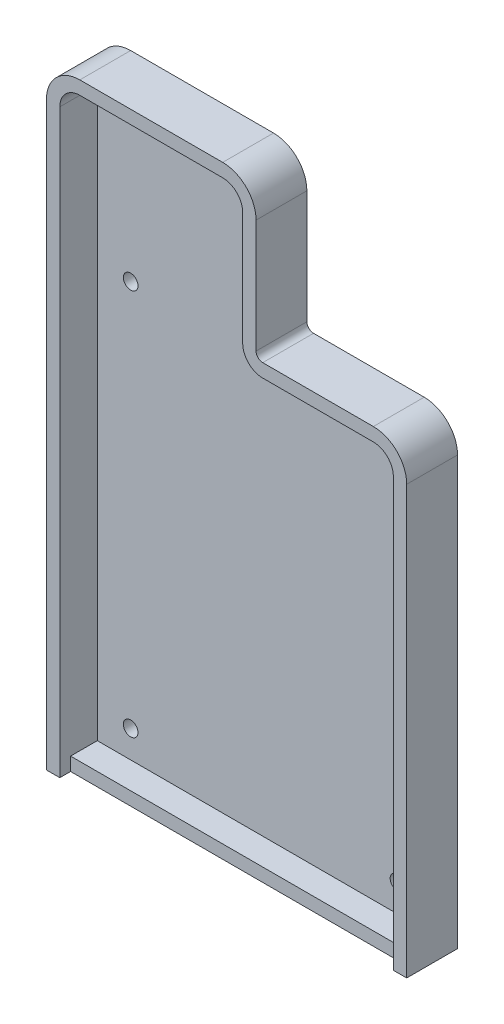
ISO-10303-21;
HEADER;
FILE_DESCRIPTION(('STEP AP214'),'2;1');
FILE_NAME('part.step','',(''),(''),'','','');
FILE_SCHEMA(('AUTOMOTIVE_DESIGN { 1 0 10303 214 1 1 1 1 }'));
ENDSEC;
DATA;
#1=APPLICATION_CONTEXT('core data for automotive mechanical design processes');
#2=APPLICATION_PROTOCOL_DEFINITION('international standard','automotive_design',2000,#1);
#3=PRODUCT_CONTEXT('',#1,'mechanical');
#4=PRODUCT('Part','Part','',(#3));
#5=PRODUCT_RELATED_PRODUCT_CATEGORY('part','',(#4));
#6=PRODUCT_DEFINITION_FORMATION('','',#4);
#7=PRODUCT_DEFINITION_CONTEXT('part definition',#1,'design');
#8=PRODUCT_DEFINITION('design','',#6,#7);
#9=PRODUCT_DEFINITION_SHAPE('','',#8);
#10=(LENGTH_UNIT() NAMED_UNIT(*) SI_UNIT(.MILLI.,.METRE.));
#11=(NAMED_UNIT(*) PLANE_ANGLE_UNIT() SI_UNIT($,.RADIAN.));
#12=(NAMED_UNIT(*) SI_UNIT($,.STERADIAN.) SOLID_ANGLE_UNIT());
#13=UNCERTAINTY_MEASURE_WITH_UNIT(LENGTH_MEASURE(1.E-05),#10,'distance_accuracy_value','');
#14=(GEOMETRIC_REPRESENTATION_CONTEXT(3) GLOBAL_UNCERTAINTY_ASSIGNED_CONTEXT((#13)) GLOBAL_UNIT_ASSIGNED_CONTEXT((#10,
#11,#12)) REPRESENTATION_CONTEXT('',''));
#15=CARTESIAN_POINT('',(0.,0.,0.));
#16=DIRECTION('',(0.,0.,1.));
#17=DIRECTION('',(1.,0.,0.));
#18=AXIS2_PLACEMENT_3D('',#15,#16,#17);
#19=CARTESIAN_POINT('',(225.,224.,-10.7312698372209));
#20=DIRECTION('',(0.,0.,1.));
#21=DIRECTION('',(1.,0.,0.));
#22=AXIS2_PLACEMENT_3D('',#19,#20,#21);
#23=CYLINDRICAL_SURFACE('',#22,1.09999999999999);
#24=CARTESIAN_POINT('',(225.,224.,-7.62));
#25=DIRECTION('',(0.,0.,1.));
#26=DIRECTION('',(1.,0.,0.));
#27=AXIS2_PLACEMENT_3D('',#24,#25,#26);
#28=CIRCLE('',#27,1.09999999999999);
#29=CARTESIAN_POINT('',(226.1,224.,-7.62));
#30=VERTEX_POINT('',#29);
#31=EDGE_CURVE('E217',#30,#30,#28,.T.);
#32=ORIENTED_EDGE('',*,*,#31,.F.);
#33=EDGE_LOOP('',(#32));
#34=FACE_BOUND('',#33,.T.);
#35=CARTESIAN_POINT('',(225.,224.,-5.62));
#36=DIRECTION('',(0.,0.,1.));
#37=DIRECTION('',(1.,0.,0.));
#38=AXIS2_PLACEMENT_3D('',#35,#36,#37);
#39=CIRCLE('',#38,1.09999999999999);
#40=CARTESIAN_POINT('',(226.1,224.,-5.62));
#41=VERTEX_POINT('',#40);
#42=EDGE_CURVE('E386',#41,#41,#39,.T.);
#43=ORIENTED_EDGE('',*,*,#42,.T.);
#44=EDGE_LOOP('',(#43));
#45=FACE_BOUND('',#44,.T.);
#46=ADVANCED_FACE('F43',(#34,#45),#23,.F.);
#47=CARTESIAN_POINT('',(205.,224.,-10.7312698372209));
#48=DIRECTION('',(0.,0.,1.));
#49=DIRECTION('',(1.,0.,0.));
#50=AXIS2_PLACEMENT_3D('',#47,#48,#49);
#51=CYLINDRICAL_SURFACE('',#50,1.10000000000002);
#52=CARTESIAN_POINT('',(205.,224.,-7.62));
#53=DIRECTION('',(0.,0.,1.));
#54=DIRECTION('',(1.,0.,0.));
#55=AXIS2_PLACEMENT_3D('',#52,#53,#54);
#56=CIRCLE('',#55,1.10000000000002);
#57=CARTESIAN_POINT('',(206.1,224.,-7.62));
#58=VERTEX_POINT('',#57);
#59=EDGE_CURVE('E394',#58,#58,#56,.T.);
#60=ORIENTED_EDGE('',*,*,#59,.F.);
#61=EDGE_LOOP('',(#60));
#62=FACE_BOUND('',#61,.T.);
#63=CARTESIAN_POINT('',(205.,224.,-5.62));
#64=DIRECTION('',(0.,0.,1.));
#65=DIRECTION('',(1.,0.,0.));
#66=AXIS2_PLACEMENT_3D('',#63,#64,#65);
#67=CIRCLE('',#66,1.10000000000002);
#68=CARTESIAN_POINT('',(206.1,224.,-5.62));
#69=VERTEX_POINT('',#68);
#70=EDGE_CURVE('E412',#69,#69,#67,.T.);
#71=ORIENTED_EDGE('',*,*,#70,.T.);
#72=EDGE_LOOP('',(#71));
#73=FACE_BOUND('',#72,.T.);
#74=ADVANCED_FACE('F407',(#62,#73),#51,.F.);
#75=CARTESIAN_POINT('',(205.,166.,-10.7312698372209));
#76=DIRECTION('',(0.,0.,1.));
#77=DIRECTION('',(1.,0.,0.));
#78=AXIS2_PLACEMENT_3D('',#75,#76,#77);
#79=CYLINDRICAL_SURFACE('',#78,1.10000000000002);
#80=CARTESIAN_POINT('',(205.,166.,-7.62));
#81=DIRECTION('',(0.,0.,1.));
#82=DIRECTION('',(1.,0.,0.));
#83=AXIS2_PLACEMENT_3D('',#80,#81,#82);
#84=CIRCLE('',#83,1.10000000000002);
#85=CARTESIAN_POINT('',(206.1,166.,-7.62));
#86=VERTEX_POINT('',#85);
#87=EDGE_CURVE('E397',#86,#86,#84,.T.);
#88=ORIENTED_EDGE('',*,*,#87,.F.);
#89=EDGE_LOOP('',(#88));
#90=FACE_BOUND('',#89,.T.);
#91=CARTESIAN_POINT('',(205.,166.,-5.62));
#92=DIRECTION('',(0.,0.,1.));
#93=DIRECTION('',(1.,0.,0.));
#94=AXIS2_PLACEMENT_3D('',#91,#92,#93);
#95=CIRCLE('',#94,1.10000000000002);
#96=CARTESIAN_POINT('',(206.1,166.,-5.62));
#97=VERTEX_POINT('',#96);
#98=EDGE_CURVE('E414',#97,#97,#95,.T.);
#99=ORIENTED_EDGE('',*,*,#98,.T.);
#100=EDGE_LOOP('',(#99));
#101=FACE_BOUND('',#100,.T.);
#102=ADVANCED_FACE('F548',(#90,#101),#79,.F.);
#103=CARTESIAN_POINT('',(245.,166.,-10.7312698372209));
#104=DIRECTION('',(0.,0.,1.));
#105=DIRECTION('',(1.,0.,0.));
#106=AXIS2_PLACEMENT_3D('',#103,#104,#105);
#107=CYLINDRICAL_SURFACE('',#106,1.10000000000002);
#108=CARTESIAN_POINT('',(245.,166.,-7.62));
#109=DIRECTION('',(0.,0.,1.));
#110=DIRECTION('',(1.,0.,0.));
#111=AXIS2_PLACEMENT_3D('',#108,#109,#110);
#112=CIRCLE('',#111,1.10000000000002);
#113=CARTESIAN_POINT('',(246.1,166.,-7.62));
#114=VERTEX_POINT('',#113);
#115=EDGE_CURVE('E390',#114,#114,#112,.T.);
#116=ORIENTED_EDGE('',*,*,#115,.F.);
#117=EDGE_LOOP('',(#116));
#118=FACE_BOUND('',#117,.T.);
#119=CARTESIAN_POINT('',(245.,166.,-5.62));
#120=DIRECTION('',(0.,0.,1.));
#121=DIRECTION('',(1.,0.,0.));
#122=AXIS2_PLACEMENT_3D('',#119,#120,#121);
#123=CIRCLE('',#122,1.10000000000002);
#124=CARTESIAN_POINT('',(246.1,166.,-5.62));
#125=VERTEX_POINT('',#124);
#126=EDGE_CURVE('E47',#125,#125,#123,.T.);
#127=ORIENTED_EDGE('',*,*,#126,.T.);
#128=EDGE_LOOP('',(#127));
#129=FACE_BOUND('',#128,.T.);
#130=ADVANCED_FACE('F490',(#118,#129),#107,.F.);
#131=CARTESIAN_POINT('',(203.00109420289,246.9989057971,-7.62));
#132=DIRECTION('',(0.,0.,1.));
#133=DIRECTION('',(1.,0.,0.));
#134=AXIS2_PLACEMENT_3D('',#131,#132,#133);
#135=CYLINDRICAL_SURFACE('',#134,3.0010944023689);
#136=DIRECTION('',(0.,0.,1.));
#137=VECTOR('',#136,1.);
#138=CARTESIAN_POINT('',(200.,247.,-7.62));
#139=LINE('',#138,#137);
#140=CARTESIAN_POINT('',(199.999999999995,247.,-5.62));
#141=VERTEX_POINT('',#140);
#142=CARTESIAN_POINT('',(200.,247.,0.));
#143=VERTEX_POINT('',#142);
#144=EDGE_CURVE('E68',#141,#143,#139,.T.);
#145=ORIENTED_EDGE('',*,*,#144,.F.);
#146=CARTESIAN_POINT('',(203.00109420289,246.9989057971,-5.62));
#147=DIRECTION('',(0.,0.,1.));
#148=DIRECTION('',(1.,0.,0.));
#149=AXIS2_PLACEMENT_3D('',#146,#147,#148);
#150=CIRCLE('',#149,3.0010944023689);
#151=CARTESIAN_POINT('',(203.,250.,-5.62));
#152=VERTEX_POINT('',#151);
#153=EDGE_CURVE('E424',#141,#152,#150,.F.);
#154=ORIENTED_EDGE('',*,*,#153,.T.);
#155=DIRECTION('',(0.,0.,1.));
#156=VECTOR('',#155,1.);
#157=CARTESIAN_POINT('',(203.,250.,-7.62));
#158=LINE('',#157,#156);
#159=CARTESIAN_POINT('',(203.,250.,0.));
#160=VERTEX_POINT('',#159);
#161=EDGE_CURVE('E243',#152,#160,#158,.T.);
#162=ORIENTED_EDGE('',*,*,#161,.T.);
#163=CARTESIAN_POINT('',(203.00109420289,246.9989057971,0.));
#164=DIRECTION('',(0.,0.,1.));
#165=DIRECTION('',(1.,0.,0.));
#166=AXIS2_PLACEMENT_3D('',#163,#164,#165);
#167=CIRCLE('',#166,3.0010944023689);
#168=EDGE_CURVE('E212',#160,#143,#167,.T.);
#169=ORIENTED_EDGE('',*,*,#168,.T.);
#170=EDGE_LOOP('',(#145,#154,#162,#169));
#171=FACE_BOUND('',#170,.T.);
#172=ADVANCED_FACE('F456',(#171),#135,.F.);
#173=CARTESIAN_POINT('',(203.,250.,-7.62));
#174=DIRECTION('',(0.,1.,0.));
#175=DIRECTION('',(0.,0.,1.));
#176=AXIS2_PLACEMENT_3D('',#173,#174,#175);
#177=PLANE('',#176);
#178=ORIENTED_EDGE('',*,*,#161,.F.);
#179=DIRECTION('',(1.,0.,0.));
#180=VECTOR('',#179,1.);
#181=CARTESIAN_POINT('',(224.416,250.,-5.62));
#182=LINE('',#181,#180);
#183=CARTESIAN_POINT('',(224.416,250.,-5.62));
#184=VERTEX_POINT('',#183);
#185=EDGE_CURVE('E427',#152,#184,#182,.T.);
#186=ORIENTED_EDGE('',*,*,#185,.T.);
#187=DIRECTION('',(0.,0.,1.));
#188=VECTOR('',#187,1.);
#189=CARTESIAN_POINT('',(224.416,250.,-7.62));
#190=LINE('',#189,#188);
#191=CARTESIAN_POINT('',(224.416,250.,0.));
#192=VERTEX_POINT('',#191);
#193=EDGE_CURVE('E246',#184,#192,#190,.T.);
#194=ORIENTED_EDGE('',*,*,#193,.T.);
#195=DIRECTION('',(-1.,0.,0.));
#196=VECTOR('',#195,1.);
#197=CARTESIAN_POINT('',(203.,250.,0.));
#198=LINE('',#197,#196);
#199=EDGE_CURVE('E240',#192,#160,#198,.T.);
#200=ORIENTED_EDGE('',*,*,#199,.T.);
#201=EDGE_LOOP('',(#178,#186,#194,#200));
#202=FACE_BOUND('',#201,.T.);
#203=ADVANCED_FACE('F458',(#202),#177,.F.);
#204=CARTESIAN_POINT('',(224.4149057971,246.9989057971,-7.62));
#205=DIRECTION('',(0.,0.,1.));
#206=DIRECTION('',(1.,0.,0.));
#207=AXIS2_PLACEMENT_3D('',#204,#205,#206);
#208=CYLINDRICAL_SURFACE('',#207,3.00109440237391);
#209=ORIENTED_EDGE('',*,*,#193,.F.);
#210=CARTESIAN_POINT('',(224.4149057971,246.9989057971,-5.62));
#211=DIRECTION('',(0.,0.,1.));
#212=DIRECTION('',(1.,0.,0.));
#213=AXIS2_PLACEMENT_3D('',#210,#211,#212);
#214=CIRCLE('',#213,3.00109440237391);
#215=CARTESIAN_POINT('',(227.416,247.,-5.62));
#216=VERTEX_POINT('',#215);
#217=EDGE_CURVE('E430',#184,#216,#214,.F.);
#218=ORIENTED_EDGE('',*,*,#217,.T.);
#219=DIRECTION('',(0.,0.,1.));
#220=VECTOR('',#219,1.);
#221=CARTESIAN_POINT('',(227.416,247.,-7.62));
#222=LINE('',#221,#220);
#223=CARTESIAN_POINT('',(227.416,247.,0.));
#224=VERTEX_POINT('',#223);
#225=EDGE_CURVE('E248',#216,#224,#222,.T.);
#226=ORIENTED_EDGE('',*,*,#225,.T.);
#227=CARTESIAN_POINT('',(224.4149057971,246.9989057971,0.));
#228=DIRECTION('',(0.,0.,1.));
#229=DIRECTION('',(1.,0.,0.));
#230=AXIS2_PLACEMENT_3D('',#227,#228,#229);
#231=CIRCLE('',#230,3.00109440237391);
#232=EDGE_CURVE('E237',#224,#192,#231,.T.);
#233=ORIENTED_EDGE('',*,*,#232,.T.);
#234=EDGE_LOOP('',(#209,#218,#226,#233));
#235=FACE_BOUND('',#234,.T.);
#236=ADVANCED_FACE('F463',(#235),#208,.F.);
#237=CARTESIAN_POINT('',(227.416,247.,-7.62));
#238=DIRECTION('',(1.,0.,0.));
#239=DIRECTION('',(0.,0.,-1.));
#240=AXIS2_PLACEMENT_3D('',#237,#238,#239);
#241=PLANE('',#240);
#242=ORIENTED_EDGE('',*,*,#225,.F.);
#243=DIRECTION('',(0.,-1.,0.));
#244=VECTOR('',#243,1.);
#245=CARTESIAN_POINT('',(227.416,230.,-5.62));
#246=LINE('',#245,#244);
#247=CARTESIAN_POINT('',(227.416,230.,-5.62));
#248=VERTEX_POINT('',#247);
#249=EDGE_CURVE('E433',#216,#248,#246,.T.);
#250=ORIENTED_EDGE('',*,*,#249,.T.);
#251=DIRECTION('',(0.,0.,1.));
#252=VECTOR('',#251,1.);
#253=CARTESIAN_POINT('',(227.416,230.,-7.62));
#254=LINE('',#253,#252);
#255=CARTESIAN_POINT('',(227.416,230.,0.));
#256=VERTEX_POINT('',#255);
#257=EDGE_CURVE('E250',#248,#256,#254,.T.);
#258=ORIENTED_EDGE('',*,*,#257,.T.);
#259=DIRECTION('',(0.,1.,0.));
#260=VECTOR('',#259,1.);
#261=CARTESIAN_POINT('',(227.416,247.,0.));
#262=LINE('',#261,#260);
#263=EDGE_CURVE('E234',#256,#224,#262,.T.);
#264=ORIENTED_EDGE('',*,*,#263,.T.);
#265=EDGE_LOOP('',(#242,#250,#258,#264));
#266=FACE_BOUND('',#265,.T.);
#267=ADVANCED_FACE('F466',(#266),#241,.F.);
#268=CARTESIAN_POINT('',(230.41709420289,230.00109420289,-7.62));
#269=DIRECTION('',(0.,0.,1.));
#270=DIRECTION('',(1.,0.,0.));
#271=AXIS2_PLACEMENT_3D('',#268,#269,#270);
#272=CYLINDRICAL_SURFACE('',#271,3.00109440236389);
#273=ORIENTED_EDGE('',*,*,#257,.F.);
#274=CARTESIAN_POINT('',(230.41709420289,230.00109420289,-5.62));
#275=DIRECTION('',(0.,0.,1.));
#276=DIRECTION('',(1.,0.,0.));
#277=AXIS2_PLACEMENT_3D('',#274,#275,#276);
#278=CIRCLE('',#277,3.00109440236389);
#279=CARTESIAN_POINT('',(230.416,227.,-5.62));
#280=VERTEX_POINT('',#279);
#281=EDGE_CURVE('E436',#248,#280,#278,.T.);
#282=ORIENTED_EDGE('',*,*,#281,.T.);
#283=DIRECTION('',(0.,0.,1.));
#284=VECTOR('',#283,1.);
#285=CARTESIAN_POINT('',(230.416,227.,-7.62));
#286=LINE('',#285,#284);
#287=CARTESIAN_POINT('',(230.416,227.,0.));
#288=VERTEX_POINT('',#287);
#289=EDGE_CURVE('E252',#280,#288,#286,.T.);
#290=ORIENTED_EDGE('',*,*,#289,.T.);
#291=CARTESIAN_POINT('',(230.41709420289,230.00109420289,0.));
#292=DIRECTION('',(0.,0.,-1.));
#293=DIRECTION('',(1.,0.,0.));
#294=AXIS2_PLACEMENT_3D('',#291,#292,#293);
#295=CIRCLE('',#294,3.00109440236389);
#296=EDGE_CURVE('E231',#288,#256,#295,.T.);
#297=ORIENTED_EDGE('',*,*,#296,.T.);
#298=EDGE_LOOP('',(#273,#282,#290,#297));
#299=FACE_BOUND('',#298,.T.);
#300=ADVANCED_FACE('F469',(#299),#272,.T.);
#301=CARTESIAN_POINT('',(230.416,227.,-7.62));
#302=DIRECTION('',(0.,1.,0.));
#303=DIRECTION('',(0.,0.,1.));
#304=AXIS2_PLACEMENT_3D('',#301,#302,#303);
#305=PLANE('',#304);
#306=ORIENTED_EDGE('',*,*,#289,.F.);
#307=DIRECTION('',(1.,0.,0.));
#308=VECTOR('',#307,1.);
#309=CARTESIAN_POINT('',(247.,227.,-5.62));
#310=LINE('',#309,#308);
#311=CARTESIAN_POINT('',(247.,227.,-5.62));
#312=VERTEX_POINT('',#311);
#313=EDGE_CURVE('E439',#280,#312,#310,.T.);
#314=ORIENTED_EDGE('',*,*,#313,.T.);
#315=DIRECTION('',(0.,0.,1.));
#316=VECTOR('',#315,1.);
#317=CARTESIAN_POINT('',(247.,227.,-7.62));
#318=LINE('',#317,#316);
#319=CARTESIAN_POINT('',(247.,227.,0.));
#320=VERTEX_POINT('',#319);
#321=EDGE_CURVE('E254',#312,#320,#318,.T.);
#322=ORIENTED_EDGE('',*,*,#321,.T.);
#323=DIRECTION('',(-1.,0.,0.));
#324=VECTOR('',#323,1.);
#325=CARTESIAN_POINT('',(230.416,227.,0.));
#326=LINE('',#325,#324);
#327=EDGE_CURVE('E228',#320,#288,#326,.T.);
#328=ORIENTED_EDGE('',*,*,#327,.T.);
#329=EDGE_LOOP('',(#306,#314,#322,#328));
#330=FACE_BOUND('',#329,.T.);
#331=ADVANCED_FACE('F473',(#330),#305,.F.);
#332=CARTESIAN_POINT('',(246.9989057971,223.9989057971,-7.62));
#333=DIRECTION('',(0.,0.,1.));
#334=DIRECTION('',(1.,0.,0.));
#335=AXIS2_PLACEMENT_3D('',#332,#333,#334);
#336=CYLINDRICAL_SURFACE('',#335,3.00109440237391);
#337=ORIENTED_EDGE('',*,*,#321,.F.);
#338=CARTESIAN_POINT('',(246.9989057971,223.9989057971,-5.62));
#339=DIRECTION('',(0.,0.,1.));
#340=DIRECTION('',(1.,0.,0.));
#341=AXIS2_PLACEMENT_3D('',#338,#339,#340);
#342=CIRCLE('',#341,3.00109440237391);
#343=CARTESIAN_POINT('',(250.,224.,-5.62));
#344=VERTEX_POINT('',#343);
#345=EDGE_CURVE('E442',#312,#344,#342,.F.);
#346=ORIENTED_EDGE('',*,*,#345,.T.);
#347=DIRECTION('',(0.,0.,1.));
#348=VECTOR('',#347,1.);
#349=CARTESIAN_POINT('',(250.,224.,-7.62));
#350=LINE('',#349,#348);
#351=CARTESIAN_POINT('',(250.,224.,0.));
#352=VERTEX_POINT('',#351);
#353=EDGE_CURVE('E256',#344,#352,#350,.T.);
#354=ORIENTED_EDGE('',*,*,#353,.T.);
#355=CARTESIAN_POINT('',(246.9989057971,223.9989057971,0.));
#356=DIRECTION('',(0.,0.,1.));
#357=DIRECTION('',(1.,0.,0.));
#358=AXIS2_PLACEMENT_3D('',#355,#356,#357);
#359=CIRCLE('',#358,3.00109440237391);
#360=EDGE_CURVE('E225',#352,#320,#359,.T.);
#361=ORIENTED_EDGE('',*,*,#360,.T.);
#362=EDGE_LOOP('',(#337,#346,#354,#361));
#363=FACE_BOUND('',#362,.T.);
#364=ADVANCED_FACE('F447',(#363),#336,.F.);
#365=CARTESIAN_POINT('',(250.,224.,-7.62));
#366=DIRECTION('',(1.,0.,0.));
#367=DIRECTION('',(0.,0.,-1.));
#368=AXIS2_PLACEMENT_3D('',#365,#366,#367);
#369=PLANE('',#368);
#370=ORIENTED_EDGE('',*,*,#353,.F.);
#371=DIRECTION('',(0.,-1.,0.));
#372=VECTOR('',#371,1.);
#373=CARTESIAN_POINT('',(250.,161.907096774194,-5.62));
#374=LINE('',#373,#372);
#375=CARTESIAN_POINT('',(250.,161.907096774194,-5.62));
#376=VERTEX_POINT('',#375);
#377=EDGE_CURVE('E200',#344,#376,#374,.T.);
#378=ORIENTED_EDGE('',*,*,#377,.T.);
#379=DIRECTION('',(0.,0.,1.));
#380=VECTOR('',#379,1.);
#381=CARTESIAN_POINT('',(250.,161.907096774194,-108.913433147227));
#382=LINE('',#381,#380);
#383=CARTESIAN_POINT('',(250.,161.907096774194,-1.61540190000009));
#384=VERTEX_POINT('',#383);
#385=EDGE_CURVE('E193',#376,#384,#382,.T.);
#386=ORIENTED_EDGE('',*,*,#385,.T.);
#387=DIRECTION('',(0.,-1.,0.));
#388=VECTOR('',#387,1.);
#389=CARTESIAN_POINT('',(250.,224.,-1.61540190000009));
#390=LINE('',#389,#388);
#391=CARTESIAN_POINT('',(250.,159.907096774194,-1.61540190000009));
#392=VERTEX_POINT('',#391);
#393=EDGE_CURVE('E197',#384,#392,#390,.T.);
#394=ORIENTED_EDGE('',*,*,#393,.T.);
#395=DIRECTION('',(0.,0.,1.));
#396=VECTOR('',#395,1.);
#397=CARTESIAN_POINT('',(250.,159.907096774194,-1.61540190000009));
#398=LINE('',#397,#396);
#399=CARTESIAN_POINT('',(250.,159.907096774194,0.));
#400=VERTEX_POINT('',#399);
#401=EDGE_CURVE('E388',#392,#400,#398,.T.);
#402=ORIENTED_EDGE('',*,*,#401,.T.);
#403=DIRECTION('',(0.,1.,0.));
#404=VECTOR('',#403,1.);
#405=CARTESIAN_POINT('',(250.,224.,0.));
#406=LINE('',#405,#404);
#407=EDGE_CURVE('E222',#400,#352,#406,.T.);
#408=ORIENTED_EDGE('',*,*,#407,.T.);
#409=EDGE_LOOP('',(#370,#378,#386,#394,#402,#408));
#410=FACE_BOUND('',#409,.T.);
#411=ADVANCED_FACE('F194',(#410),#369,.F.);
#412=CARTESIAN_POINT('',(200.,161.907096774194,-7.62));
#413=DIRECTION('',(-1.,0.,0.));
#414=DIRECTION('',(0.,0.,1.));
#415=AXIS2_PLACEMENT_3D('',#412,#413,#414);
#416=PLANE('',#415);
#417=DIRECTION('',(0.,1.,0.));
#418=VECTOR('',#417,1.);
#419=CARTESIAN_POINT('',(200.,161.907096774194,-1.61540190000009));
#420=LINE('',#419,#418);
#421=CARTESIAN_POINT('',(200.,159.907096774194,-1.61540190000009));
#422=VERTEX_POINT('',#421);
#423=CARTESIAN_POINT('',(200.,161.907096774194,-1.61540190000009));
#424=VERTEX_POINT('',#423);
#425=EDGE_CURVE('E213',#422,#424,#420,.T.);
#426=ORIENTED_EDGE('',*,*,#425,.T.);
#427=DIRECTION('',(0.,0.,1.));
#428=VECTOR('',#427,1.);
#429=CARTESIAN_POINT('',(200.,161.907096774194,-108.913433147227));
#430=LINE('',#429,#428);
#431=CARTESIAN_POINT('',(200.,161.907096774194,-5.62));
#432=VERTEX_POINT('',#431);
#433=EDGE_CURVE('E60',#432,#424,#430,.T.);
#434=ORIENTED_EDGE('',*,*,#433,.F.);
#435=DIRECTION('',(0.,1.,0.));
#436=VECTOR('',#435,1.);
#437=CARTESIAN_POINT('',(200.,247.,-5.62));
#438=LINE('',#437,#436);
#439=EDGE_CURVE('E421',#432,#141,#438,.T.);
#440=ORIENTED_EDGE('',*,*,#439,.T.);
#441=ORIENTED_EDGE('',*,*,#144,.T.);
#442=DIRECTION('',(0.,-1.,0.));
#443=VECTOR('',#442,1.);
#444=CARTESIAN_POINT('',(200.,161.907096774194,0.));
#445=LINE('',#444,#443);
#446=CARTESIAN_POINT('',(200.,159.907096774194,0.));
#447=VERTEX_POINT('',#446);
#448=EDGE_CURVE('E215',#143,#447,#445,.T.);
#449=ORIENTED_EDGE('',*,*,#448,.T.);
#450=DIRECTION('',(0.,0.,-1.));
#451=VECTOR('',#450,1.);
#452=CARTESIAN_POINT('',(200.,159.907096774194,0.));
#453=LINE('',#452,#451);
#454=EDGE_CURVE('E381',#447,#422,#453,.T.);
#455=ORIENTED_EDGE('',*,*,#454,.T.);
#456=EDGE_LOOP('',(#426,#434,#440,#441,#449,#455));
#457=FACE_BOUND('',#456,.T.);
#458=ADVANCED_FACE('F385',(#457),#416,.F.);
#459=CARTESIAN_POINT('',(246.9989057971,223.9989057971,-7.62));
#460=DIRECTION('',(0.,0.,1.));
#461=DIRECTION('',(1.,0.,0.));
#462=AXIS2_PLACEMENT_3D('',#459,#460,#461);
#463=CYLINDRICAL_SURFACE('',#462,5.00109434919736);
#464=CARTESIAN_POINT('',(246.9989057971,223.9989057971,0.));
#465=DIRECTION('',(0.,0.,1.));
#466=DIRECTION('',(1.,0.,0.));
#467=AXIS2_PLACEMENT_3D('',#464,#465,#466);
#468=CIRCLE('',#467,5.00109434919736);
#469=CARTESIAN_POINT('',(251.999999933533,224.000364601293,0.));
#470=VERTEX_POINT('',#469);
#471=CARTESIAN_POINT('',(247.000364601293,228.999999933533,0.));
#472=VERTEX_POINT('',#471);
#473=EDGE_CURVE('E245',#470,#472,#468,.T.);
#474=ORIENTED_EDGE('',*,*,#473,.F.);
#475=DIRECTION('',(0.,0.,1.));
#476=VECTOR('',#475,1.);
#477=CARTESIAN_POINT('',(251.999999933533,224.000364601293,-7.62));
#478=LINE('',#477,#476);
#479=CARTESIAN_POINT('',(251.999999933533,224.000364601293,-7.62));
#480=VERTEX_POINT('',#479);
#481=EDGE_CURVE('E12',#480,#470,#478,.T.);
#482=ORIENTED_EDGE('',*,*,#481,.F.);
#483=CARTESIAN_POINT('',(246.9989057971,223.9989057971,-7.62));
#484=DIRECTION('',(0.,0.,1.));
#485=DIRECTION('',(1.,0.,0.));
#486=AXIS2_PLACEMENT_3D('',#483,#484,#485);
#487=CIRCLE('',#486,5.00109434919736);
#488=CARTESIAN_POINT('',(247.000364601293,228.999999933533,-7.62));
#489=VERTEX_POINT('',#488);
#490=EDGE_CURVE('E259',#480,#489,#487,.T.);
#491=ORIENTED_EDGE('',*,*,#490,.T.);
#492=DIRECTION('',(0.,0.,1.));
#493=VECTOR('',#492,1.);
#494=CARTESIAN_POINT('',(247.000364601293,228.999999933533,-7.62));
#495=LINE('',#494,#493);
#496=EDGE_CURVE('E290',#489,#472,#495,.T.);
#497=ORIENTED_EDGE('',*,*,#496,.T.);
#498=EDGE_LOOP('',(#474,#482,#491,#497));
#499=FACE_BOUND('',#498,.T.);
#500=ADVANCED_FACE('F45',(#499),#463,.T.);
#501=CARTESIAN_POINT('',(251.999999933533,224.000364601293,-7.62));
#502=DIRECTION('',(1.,1.03703643668424E-09,0.));
#503=DIRECTION('',(-1.03703643668424E-09,1.,0.));
#504=AXIS2_PLACEMENT_3D('',#501,#502,#503);
#505=PLANE('',#504);
#506=DIRECTION('',(-1.03703643668424E-09,1.,0.));
#507=VECTOR('',#506,1.);
#508=CARTESIAN_POINT('',(251.999999933533,224.000364601293,0.));
#509=LINE('',#508,#507);
#510=CARTESIAN_POINT('',(252.,159.907096774194,0.));
#511=VERTEX_POINT('',#510);
#512=EDGE_CURVE('E263',#511,#470,#509,.T.);
#513=ORIENTED_EDGE('',*,*,#512,.F.);
#514=DIRECTION('',(0.,0.,1.));
#515=VECTOR('',#514,1.);
#516=CARTESIAN_POINT('',(252.,159.907096774194,-7.62));
#517=LINE('',#516,#515);
#518=CARTESIAN_POINT('',(252.,159.907096774194,-7.62));
#519=VERTEX_POINT('',#518);
#520=EDGE_CURVE('E52',#519,#511,#517,.T.);
#521=ORIENTED_EDGE('',*,*,#520,.F.);
#522=DIRECTION('',(-1.03703643668424E-09,1.,0.));
#523=VECTOR('',#522,1.);
#524=CARTESIAN_POINT('',(251.999999933533,224.000364601293,-7.62));
#525=LINE('',#524,#523);
#526=EDGE_CURVE('E287',#519,#480,#525,.T.);
#527=ORIENTED_EDGE('',*,*,#526,.T.);
#528=ORIENTED_EDGE('',*,*,#481,.T.);
#529=EDGE_LOOP('',(#513,#521,#527,#528));
#530=FACE_BOUND('',#529,.T.);
#531=ADVANCED_FACE('F348',(#530),#505,.T.);
#532=CARTESIAN_POINT('',(198.,159.907096774194,-7.62));
#533=DIRECTION('',(0.,-1.,0.));
#534=DIRECTION('',(0.,0.,-1.));
#535=AXIS2_PLACEMENT_3D('',#532,#533,#534);
#536=PLANE('',#535);
#537=ORIENTED_EDGE('',*,*,#401,.F.);
#538=DIRECTION('',(1.,0.,0.));
#539=VECTOR('',#538,1.);
#540=CARTESIAN_POINT('',(200.,159.907096774194,-1.61540190000009));
#541=LINE('',#540,#539);
#542=EDGE_CURVE('E210',#422,#392,#541,.T.);
#543=ORIENTED_EDGE('',*,*,#542,.F.);
#544=ORIENTED_EDGE('',*,*,#454,.F.);
#545=DIRECTION('',(1.,0.,0.));
#546=VECTOR('',#545,1.);
#547=CARTESIAN_POINT('',(198.,159.907096774194,0.));
#548=LINE('',#547,#546);
#549=CARTESIAN_POINT('',(198.,159.907096774194,0.));
#550=VERTEX_POINT('',#549);
#551=EDGE_CURVE('E315',#550,#447,#548,.T.);
#552=ORIENTED_EDGE('',*,*,#551,.F.);
#553=DIRECTION('',(0.,0.,1.));
#554=VECTOR('',#553,1.);
#555=CARTESIAN_POINT('',(198.,159.907096774194,-7.62));
#556=LINE('',#555,#554);
#557=CARTESIAN_POINT('',(198.,159.907096774194,-7.62));
#558=VERTEX_POINT('',#557);
#559=EDGE_CURVE('E322',#558,#550,#556,.T.);
#560=ORIENTED_EDGE('',*,*,#559,.F.);
#561=DIRECTION('',(1.,0.,0.));
#562=VECTOR('',#561,1.);
#563=CARTESIAN_POINT('',(198.,159.907096774194,-7.62));
#564=LINE('',#563,#562);
#565=EDGE_CURVE('E284',#558,#519,#564,.T.);
#566=ORIENTED_EDGE('',*,*,#565,.T.);
#567=ORIENTED_EDGE('',*,*,#520,.T.);
#568=EDGE_CURVE('E314',#400,#511,#548,.T.);
#569=ORIENTED_EDGE('',*,*,#568,.F.);
#570=EDGE_LOOP('',(#537,#543,#544,#552,#560,#566,#567,#569));
#571=FACE_BOUND('',#570,.T.);
#572=ADVANCED_FACE('F379',(#571),#536,.T.);
#573=CARTESIAN_POINT('',(198.,159.907096774194,-7.62));
#574=DIRECTION('',(-1.,7.63142292616761E-10,0.));
#575=DIRECTION('',(-7.63142292616761E-10,-1.,0.));
#576=AXIS2_PLACEMENT_3D('',#573,#574,#575);
#577=PLANE('',#576);
#578=DIRECTION('',(-7.63142292616761E-10,-1.,0.));
#579=VECTOR('',#578,1.);
#580=CARTESIAN_POINT('',(198.,159.907096774194,0.));
#581=LINE('',#580,#579);
#582=CARTESIAN_POINT('',(198.000000066465,247.000364601293,0.));
#583=VERTEX_POINT('',#582);
#584=EDGE_CURVE('E311',#583,#550,#581,.T.);
#585=ORIENTED_EDGE('',*,*,#584,.F.);
#586=DIRECTION('',(0.,0.,1.));
#587=VECTOR('',#586,1.);
#588=CARTESIAN_POINT('',(198.000000066465,247.000364601293,-7.62));
#589=LINE('',#588,#587);
#590=CARTESIAN_POINT('',(198.000000066465,247.000364601293,-7.62));
#591=VERTEX_POINT('',#590);
#592=EDGE_CURVE('E324',#591,#583,#589,.T.);
#593=ORIENTED_EDGE('',*,*,#592,.F.);
#594=DIRECTION('',(-7.63142292616761E-10,-1.,0.));
#595=VECTOR('',#594,1.);
#596=CARTESIAN_POINT('',(198.,159.907096774194,-7.62));
#597=LINE('',#596,#595);
#598=EDGE_CURVE('E281',#591,#558,#597,.T.);
#599=ORIENTED_EDGE('',*,*,#598,.T.);
#600=ORIENTED_EDGE('',*,*,#559,.T.);
#601=EDGE_LOOP('',(#585,#593,#599,#600));
#602=FACE_BOUND('',#601,.T.);
#603=ADVANCED_FACE('F375',(#602),#577,.T.);
#604=CARTESIAN_POINT('',(203.00109420289,246.9989057971,-7.62));
#605=DIRECTION('',(0.,0.,1.));
#606=DIRECTION('',(1.,0.,0.));
#607=AXIS2_PLACEMENT_3D('',#604,#605,#606);
#608=CYLINDRICAL_SURFACE('',#607,5.00109434919235);
#609=CARTESIAN_POINT('',(203.00109420289,246.9989057971,0.));
#610=DIRECTION('',(0.,0.,1.));
#611=DIRECTION('',(1.,0.,0.));
#612=AXIS2_PLACEMENT_3D('',#609,#610,#611);
#613=CIRCLE('',#612,5.00109434919235);
#614=CARTESIAN_POINT('',(202.99963539871,251.999999933528,0.));
#615=VERTEX_POINT('',#614);
#616=EDGE_CURVE('E308',#615,#583,#613,.T.);
#617=ORIENTED_EDGE('',*,*,#616,.F.);
#618=DIRECTION('',(0.,0.,1.));
#619=VECTOR('',#618,1.);
#620=CARTESIAN_POINT('',(202.99963539871,251.999999933528,-7.62));
#621=LINE('',#620,#619);
#622=CARTESIAN_POINT('',(202.99963539871,251.999999933528,-7.62));
#623=VERTEX_POINT('',#622);
#624=EDGE_CURVE('E326',#623,#615,#621,.T.);
#625=ORIENTED_EDGE('',*,*,#624,.F.);
#626=CARTESIAN_POINT('',(203.00109420289,246.9989057971,-7.62));
#627=DIRECTION('',(0.,0.,1.));
#628=DIRECTION('',(1.,0.,0.));
#629=AXIS2_PLACEMENT_3D('',#626,#627,#628);
#630=CIRCLE('',#629,5.00109434919235);
#631=EDGE_CURVE('E278',#623,#591,#630,.T.);
#632=ORIENTED_EDGE('',*,*,#631,.T.);
#633=ORIENTED_EDGE('',*,*,#592,.T.);
#634=EDGE_LOOP('',(#617,#625,#632,#633));
#635=FACE_BOUND('',#634,.T.);
#636=ADVANCED_FACE('F371',(#635),#608,.T.);
#637=CARTESIAN_POINT('',(202.99963539871,251.99999993353,-7.62));
#638=DIRECTION('',(-1.16637876016349E-13,1.,0.));
#639=DIRECTION('',(-1.,-1.16637876016349E-13,0.));
#640=AXIS2_PLACEMENT_3D('',#637,#638,#639);
#641=PLANE('',#640);
#642=DIRECTION('',(-1.,-1.16637876016349E-13,0.));
#643=VECTOR('',#642,1.);
#644=CARTESIAN_POINT('',(202.99963539871,251.99999993353,0.));
#645=LINE('',#644,#643);
#646=CARTESIAN_POINT('',(224.416364601293,251.999999933533,0.));
#647=VERTEX_POINT('',#646);
#648=EDGE_CURVE('E305',#647,#615,#645,.T.);
#649=ORIENTED_EDGE('',*,*,#648,.F.);
#650=DIRECTION('',(0.,0.,1.));
#651=VECTOR('',#650,1.);
#652=CARTESIAN_POINT('',(224.416364601293,251.999999933533,-7.62));
#653=LINE('',#652,#651);
#654=CARTESIAN_POINT('',(224.416364601293,251.999999933533,-7.62));
#655=VERTEX_POINT('',#654);
#656=EDGE_CURVE('E328',#655,#647,#653,.T.);
#657=ORIENTED_EDGE('',*,*,#656,.F.);
#658=DIRECTION('',(-1.,-1.16637876016349E-13,0.));
#659=VECTOR('',#658,1.);
#660=CARTESIAN_POINT('',(202.99963539871,251.99999993353,-7.62));
#661=LINE('',#660,#659);
#662=EDGE_CURVE('E275',#655,#623,#661,.T.);
#663=ORIENTED_EDGE('',*,*,#662,.T.);
#664=ORIENTED_EDGE('',*,*,#624,.T.);
#665=EDGE_LOOP('',(#649,#657,#663,#664));
#666=FACE_BOUND('',#665,.T.);
#667=ADVANCED_FACE('F367',(#666),#641,.T.);
#668=CARTESIAN_POINT('',(224.4149057971,246.9989057971,-7.62));
#669=DIRECTION('',(0.,0.,1.));
#670=DIRECTION('',(1.,0.,0.));
#671=AXIS2_PLACEMENT_3D('',#668,#669,#670);
#672=CYLINDRICAL_SURFACE('',#671,5.00109434919736);
#673=CARTESIAN_POINT('',(224.4149057971,246.9989057971,0.));
#674=DIRECTION('',(0.,0.,1.));
#675=DIRECTION('',(1.,0.,0.));
#676=AXIS2_PLACEMENT_3D('',#673,#674,#675);
#677=CIRCLE('',#676,5.00109434919736);
#678=CARTESIAN_POINT('',(229.415999933533,247.000364601293,0.));
#679=VERTEX_POINT('',#678);
#680=EDGE_CURVE('E302',#679,#647,#677,.T.);
#681=ORIENTED_EDGE('',*,*,#680,.F.);
#682=DIRECTION('',(0.,0.,1.));
#683=VECTOR('',#682,1.);
#684=CARTESIAN_POINT('',(229.415999933533,247.000364601293,-7.62));
#685=LINE('',#684,#683);
#686=CARTESIAN_POINT('',(229.415999933533,247.000364601293,-7.62));
#687=VERTEX_POINT('',#686);
#688=EDGE_CURVE('E330',#687,#679,#685,.T.);
#689=ORIENTED_EDGE('',*,*,#688,.F.);
#690=CARTESIAN_POINT('',(224.4149057971,246.9989057971,-7.62));
#691=DIRECTION('',(0.,0.,1.));
#692=DIRECTION('',(1.,0.,0.));
#693=AXIS2_PLACEMENT_3D('',#690,#691,#692);
#694=CIRCLE('',#693,5.00109434919736);
#695=EDGE_CURVE('E272',#687,#655,#694,.T.);
#696=ORIENTED_EDGE('',*,*,#695,.T.);
#697=ORIENTED_EDGE('',*,*,#656,.T.);
#698=EDGE_LOOP('',(#681,#689,#696,#697));
#699=FACE_BOUND('',#698,.T.);
#700=ADVANCED_FACE('F363',(#699),#672,.T.);
#701=CARTESIAN_POINT('',(229.415999933533,247.000364601293,-7.62));
#702=DIRECTION('',(1.,0.,0.));
#703=DIRECTION('',(0.,0.,-1.));
#704=AXIS2_PLACEMENT_3D('',#701,#702,#703);
#705=PLANE('',#704);
#706=DIRECTION('',(0.,1.,0.));
#707=VECTOR('',#706,1.);
#708=CARTESIAN_POINT('',(229.415999933533,247.000364601293,0.));
#709=LINE('',#708,#707);
#710=CARTESIAN_POINT('',(229.415999933533,230.00036460129,0.));
#711=VERTEX_POINT('',#710);
#712=EDGE_CURVE('E299',#711,#679,#709,.T.);
#713=ORIENTED_EDGE('',*,*,#712,.F.);
#714=DIRECTION('',(0.,0.,1.));
#715=VECTOR('',#714,1.);
#716=CARTESIAN_POINT('',(229.415999933533,230.00036460129,-7.62));
#717=LINE('',#716,#715);
#718=CARTESIAN_POINT('',(229.415999933533,230.00036460129,-7.62));
#719=VERTEX_POINT('',#718);
#720=EDGE_CURVE('E332',#719,#711,#717,.T.);
#721=ORIENTED_EDGE('',*,*,#720,.F.);
#722=DIRECTION('',(0.,1.,0.));
#723=VECTOR('',#722,1.);
#724=CARTESIAN_POINT('',(229.415999933533,247.000364601293,-7.62));
#725=LINE('',#724,#723);
#726=EDGE_CURVE('E269',#719,#687,#725,.T.);
#727=ORIENTED_EDGE('',*,*,#726,.T.);
#728=ORIENTED_EDGE('',*,*,#688,.T.);
#729=EDGE_LOOP('',(#713,#721,#727,#728));
#730=FACE_BOUND('',#729,.T.);
#731=ADVANCED_FACE('F361',(#730),#705,.T.);
#732=CARTESIAN_POINT('',(230.41709420289,230.00109420289,-7.62));
#733=DIRECTION('',(0.,0.,1.));
#734=DIRECTION('',(1.,0.,0.));
#735=AXIS2_PLACEMENT_3D('',#732,#733,#734);
#736=CYLINDRICAL_SURFACE('',#735,1.00109453522533);
#737=CARTESIAN_POINT('',(230.41709420289,230.00109420289,0.));
#738=DIRECTION('',(0.,0.,-1.));
#739=DIRECTION('',(1.,0.,0.));
#740=AXIS2_PLACEMENT_3D('',#737,#738,#739);
#741=CIRCLE('',#740,1.00109453522533);
#742=CARTESIAN_POINT('',(230.41636460129,228.999999933533,0.));
#743=VERTEX_POINT('',#742);
#744=EDGE_CURVE('E296',#743,#711,#741,.T.);
#745=ORIENTED_EDGE('',*,*,#744,.F.);
#746=DIRECTION('',(0.,0.,1.));
#747=VECTOR('',#746,1.);
#748=CARTESIAN_POINT('',(230.41636460129,228.999999933533,-7.62));
#749=LINE('',#748,#747);
#750=CARTESIAN_POINT('',(230.41636460129,228.999999933533,-7.62));
#751=VERTEX_POINT('',#750);
#752=EDGE_CURVE('E334',#751,#743,#749,.T.);
#753=ORIENTED_EDGE('',*,*,#752,.F.);
#754=CARTESIAN_POINT('',(230.41709420289,230.00109420289,-7.62));
#755=DIRECTION('',(0.,0.,-1.));
#756=DIRECTION('',(1.,0.,0.));
#757=AXIS2_PLACEMENT_3D('',#754,#755,#756);
#758=CIRCLE('',#757,1.00109453522533);
#759=EDGE_CURVE('E266',#751,#719,#758,.T.);
#760=ORIENTED_EDGE('',*,*,#759,.T.);
#761=ORIENTED_EDGE('',*,*,#720,.T.);
#762=EDGE_LOOP('',(#745,#753,#760,#761));
#763=FACE_BOUND('',#762,.T.);
#764=ADVANCED_FACE('F357',(#763),#736,.F.);
#765=CARTESIAN_POINT('',(230.41636460129,228.999999933533,-7.62));
#766=DIRECTION('',(0.,1.,0.));
#767=DIRECTION('',(0.,0.,1.));
#768=AXIS2_PLACEMENT_3D('',#765,#766,#767);
#769=PLANE('',#768);
#770=DIRECTION('',(-1.,0.,0.));
#771=VECTOR('',#770,1.);
#772=CARTESIAN_POINT('',(230.41636460129,228.999999933533,0.));
#773=LINE('',#772,#771);
#774=EDGE_CURVE('E293',#472,#743,#773,.T.);
#775=ORIENTED_EDGE('',*,*,#774,.F.);
#776=ORIENTED_EDGE('',*,*,#496,.F.);
#777=DIRECTION('',(-1.,0.,0.));
#778=VECTOR('',#777,1.);
#779=CARTESIAN_POINT('',(230.41636460129,228.999999933533,-7.62));
#780=LINE('',#779,#778);
#781=EDGE_CURVE('E262',#489,#751,#780,.T.);
#782=ORIENTED_EDGE('',*,*,#781,.T.);
#783=ORIENTED_EDGE('',*,*,#752,.T.);
#784=EDGE_LOOP('',(#775,#776,#782,#783));
#785=FACE_BOUND('',#784,.T.);
#786=ADVANCED_FACE('F341',(#785),#769,.T.);
#787=CARTESIAN_POINT('',(246.9989057971,223.9989057971,-7.62));
#788=DIRECTION('',(0.,0.,1.));
#789=DIRECTION('',(1.,0.,0.));
#790=AXIS2_PLACEMENT_3D('',#787,#788,#789);
#791=PLANE('',#790);
#792=ORIENTED_EDGE('',*,*,#115,.T.);
#793=EDGE_LOOP('',(#792));
#794=FACE_BOUND('',#793,.T.);
#795=ORIENTED_EDGE('',*,*,#87,.T.);
#796=EDGE_LOOP('',(#795));
#797=FACE_BOUND('',#796,.T.);
#798=ORIENTED_EDGE('',*,*,#59,.T.);
#799=EDGE_LOOP('',(#798));
#800=FACE_BOUND('',#799,.T.);
#801=ORIENTED_EDGE('',*,*,#31,.T.);
#802=EDGE_LOOP('',(#801));
#803=FACE_BOUND('',#802,.T.);
#804=ORIENTED_EDGE('',*,*,#490,.F.);
#805=ORIENTED_EDGE('',*,*,#526,.F.);
#806=ORIENTED_EDGE('',*,*,#565,.F.);
#807=ORIENTED_EDGE('',*,*,#598,.F.);
#808=ORIENTED_EDGE('',*,*,#631,.F.);
#809=ORIENTED_EDGE('',*,*,#662,.F.);
#810=ORIENTED_EDGE('',*,*,#695,.F.);
#811=ORIENTED_EDGE('',*,*,#726,.F.);
#812=ORIENTED_EDGE('',*,*,#759,.F.);
#813=ORIENTED_EDGE('',*,*,#781,.F.);
#814=EDGE_LOOP('',(#804,#805,#806,#807,#808,#809,#810,#811,#812,#813));
#815=FACE_BOUND('',#814,.T.);
#816=ADVANCED_FACE('F351',(#794,#797,#800,#803,#815),#791,.F.);
#817=CARTESIAN_POINT('',(246.9989057971,223.9989057971,0.));
#818=DIRECTION('',(0.,0.,1.));
#819=DIRECTION('',(1.,0.,0.));
#820=AXIS2_PLACEMENT_3D('',#817,#818,#819);
#821=PLANE('',#820);
#822=ORIENTED_EDGE('',*,*,#407,.F.);
#823=ORIENTED_EDGE('',*,*,#568,.T.);
#824=ORIENTED_EDGE('',*,*,#512,.T.);
#825=ORIENTED_EDGE('',*,*,#473,.T.);
#826=ORIENTED_EDGE('',*,*,#774,.T.);
#827=ORIENTED_EDGE('',*,*,#744,.T.);
#828=ORIENTED_EDGE('',*,*,#712,.T.);
#829=ORIENTED_EDGE('',*,*,#680,.T.);
#830=ORIENTED_EDGE('',*,*,#648,.T.);
#831=ORIENTED_EDGE('',*,*,#616,.T.);
#832=ORIENTED_EDGE('',*,*,#584,.T.);
#833=ORIENTED_EDGE('',*,*,#551,.T.);
#834=ORIENTED_EDGE('',*,*,#448,.F.);
#835=ORIENTED_EDGE('',*,*,#168,.F.);
#836=ORIENTED_EDGE('',*,*,#199,.F.);
#837=ORIENTED_EDGE('',*,*,#232,.F.);
#838=ORIENTED_EDGE('',*,*,#263,.F.);
#839=ORIENTED_EDGE('',*,*,#296,.F.);
#840=ORIENTED_EDGE('',*,*,#327,.F.);
#841=ORIENTED_EDGE('',*,*,#360,.F.);
#842=EDGE_LOOP('',(#822,#823,#824,#825,#826,#827,#828,#829,#830,#831,#832,#833,#834,#835,#836,
#837,#838,#839,#840,#841));
#843=FACE_BOUND('',#842,.T.);
#844=ADVANCED_FACE('F344',(#843),#821,.T.);
#845=CARTESIAN_POINT('',(203.00109420289,246.9989057971,-1.61540190000009));
#846=DIRECTION('',(0.,0.,-1.));
#847=DIRECTION('',(-1.,0.,0.));
#848=AXIS2_PLACEMENT_3D('',#845,#846,#847);
#849=PLANE('',#848);
#850=ORIENTED_EDGE('',*,*,#393,.F.);
#851=DIRECTION('',(1.,0.,0.));
#852=VECTOR('',#851,1.);
#853=CARTESIAN_POINT('',(200.,161.907096774194,-1.61540190000009));
#854=LINE('',#853,#852);
#855=EDGE_CURVE('E203',#424,#384,#854,.T.);
#856=ORIENTED_EDGE('',*,*,#855,.F.);
#857=ORIENTED_EDGE('',*,*,#425,.F.);
#858=ORIENTED_EDGE('',*,*,#542,.T.);
#859=EDGE_LOOP('',(#850,#856,#857,#858));
#860=FACE_BOUND('',#859,.T.);
#861=ADVANCED_FACE('F208',(#860),#849,.F.);
#862=CARTESIAN_POINT('',(200.,161.907096774194,-108.913433147227));
#863=DIRECTION('',(0.,-1.,0.));
#864=DIRECTION('',(0.,0.,-1.));
#865=AXIS2_PLACEMENT_3D('',#862,#863,#864);
#866=PLANE('',#865);
#867=DIRECTION('',(-1.,0.,0.));
#868=VECTOR('',#867,1.);
#869=CARTESIAN_POINT('',(200.,161.907096774194,-5.62));
#870=LINE('',#869,#868);
#871=EDGE_CURVE('E419',#376,#432,#870,.T.);
#872=ORIENTED_EDGE('',*,*,#871,.T.);
#873=ORIENTED_EDGE('',*,*,#433,.T.);
#874=ORIENTED_EDGE('',*,*,#855,.T.);
#875=ORIENTED_EDGE('',*,*,#385,.F.);
#876=EDGE_LOOP('',(#872,#873,#874,#875));
#877=FACE_BOUND('',#876,.T.);
#878=ADVANCED_FACE('F204',(#877),#866,.F.);
#879=CARTESIAN_POINT('',(246.9989057971,223.9989057971,-5.62));
#880=DIRECTION('',(0.,0.,1.));
#881=DIRECTION('',(1.,0.,0.));
#882=AXIS2_PLACEMENT_3D('',#879,#880,#881);
#883=PLANE('',#882);
#884=ORIENTED_EDGE('',*,*,#42,.F.);
#885=EDGE_LOOP('',(#884));
#886=FACE_BOUND('',#885,.T.);
#887=ORIENTED_EDGE('',*,*,#70,.F.);
#888=EDGE_LOOP('',(#887));
#889=FACE_BOUND('',#888,.T.);
#890=ORIENTED_EDGE('',*,*,#98,.F.);
#891=EDGE_LOOP('',(#890));
#892=FACE_BOUND('',#891,.T.);
#893=ORIENTED_EDGE('',*,*,#126,.F.);
#894=EDGE_LOOP('',(#893));
#895=FACE_BOUND('',#894,.T.);
#896=ORIENTED_EDGE('',*,*,#439,.F.);
#897=ORIENTED_EDGE('',*,*,#871,.F.);
#898=ORIENTED_EDGE('',*,*,#377,.F.);
#899=ORIENTED_EDGE('',*,*,#345,.F.);
#900=ORIENTED_EDGE('',*,*,#313,.F.);
#901=ORIENTED_EDGE('',*,*,#281,.F.);
#902=ORIENTED_EDGE('',*,*,#249,.F.);
#903=ORIENTED_EDGE('',*,*,#217,.F.);
#904=ORIENTED_EDGE('',*,*,#185,.F.);
#905=ORIENTED_EDGE('',*,*,#153,.F.);
#906=EDGE_LOOP('',(#896,#897,#898,#899,#900,#901,#902,#903,#904,#905));
#907=FACE_BOUND('',#906,.T.);
#908=ADVANCED_FACE('F451',(#886,#889,#892,#895,#907),#883,.T.);
#909=CLOSED_SHELL('',(#46,#74,#102,#130,#172,#203,#236,#267,#300,#331,#364,#411,#458,#500,#531,
#572,#603,#636,#667,#700,#731,#764,#786,#816,#844,#861,#878,#908));
#910=MANIFOLD_SOLID_BREP('B2',#909);
#911=ADVANCED_BREP_SHAPE_REPRESENTATION('',(#18,#910),#14);
#912=SHAPE_DEFINITION_REPRESENTATION(#9,#911);
ENDSEC;
END-ISO-10303-21;
